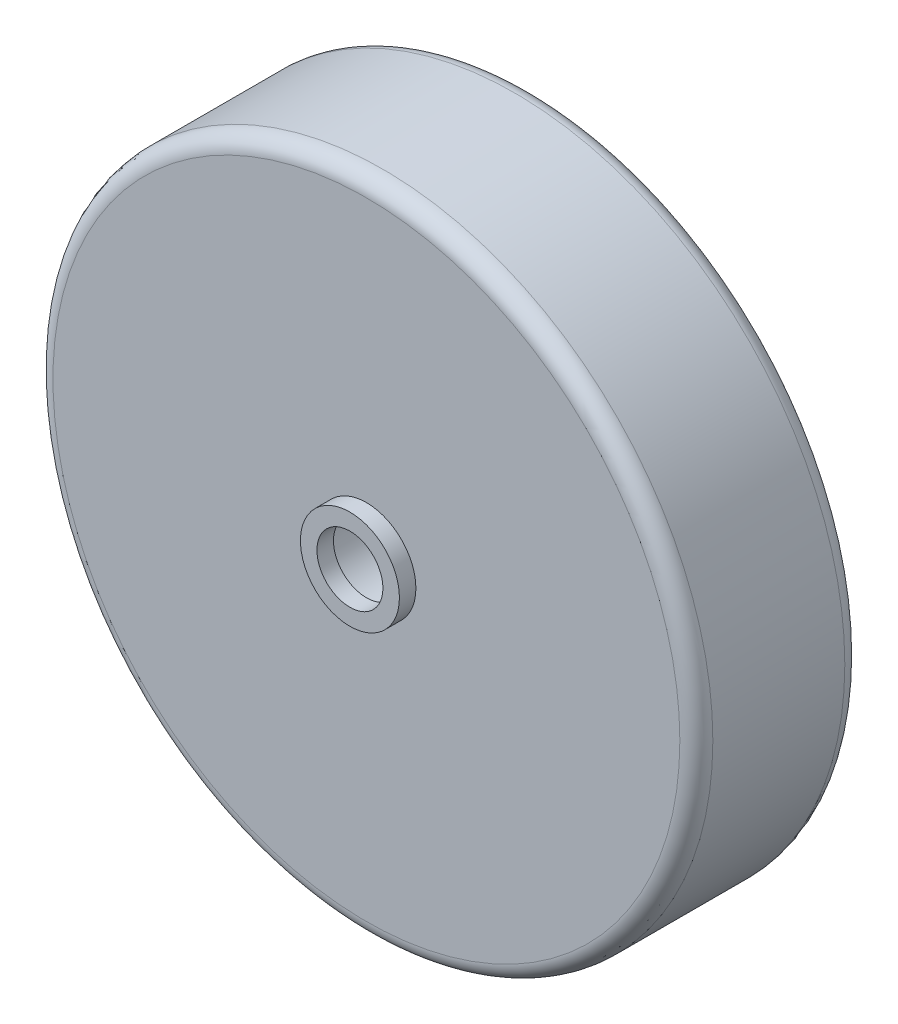
ISO-10303-21;
HEADER;
FILE_DESCRIPTION(('STEP AP214'),'2;1');
FILE_NAME('part.step','',(''),(''),'','','');
FILE_SCHEMA(('AUTOMOTIVE_DESIGN { 1 0 10303 214 1 1 1 1 }'));
ENDSEC;
DATA;
#1=APPLICATION_CONTEXT('core data for automotive mechanical design processes');
#2=APPLICATION_PROTOCOL_DEFINITION('international standard','automotive_design',2000,#1);
#3=PRODUCT_CONTEXT('',#1,'mechanical');
#4=PRODUCT('Part','Part','',(#3));
#5=PRODUCT_RELATED_PRODUCT_CATEGORY('part','',(#4));
#6=PRODUCT_DEFINITION_FORMATION('','',#4);
#7=PRODUCT_DEFINITION_CONTEXT('part definition',#1,'design');
#8=PRODUCT_DEFINITION('design','',#6,#7);
#9=PRODUCT_DEFINITION_SHAPE('','',#8);
#10=(LENGTH_UNIT() NAMED_UNIT(*) SI_UNIT(.MILLI.,.METRE.));
#11=(NAMED_UNIT(*) PLANE_ANGLE_UNIT() SI_UNIT($,.RADIAN.));
#12=(NAMED_UNIT(*) SI_UNIT($,.STERADIAN.) SOLID_ANGLE_UNIT());
#13=UNCERTAINTY_MEASURE_WITH_UNIT(LENGTH_MEASURE(1.E-05),#10,'distance_accuracy_value','');
#14=(GEOMETRIC_REPRESENTATION_CONTEXT(3) GLOBAL_UNCERTAINTY_ASSIGNED_CONTEXT((#13)) GLOBAL_UNIT_ASSIGNED_CONTEXT((#10,
#11,#12)) REPRESENTATION_CONTEXT('',''));
#15=CARTESIAN_POINT('',(0.,0.,0.));
#16=DIRECTION('',(0.,0.,1.));
#17=DIRECTION('',(1.,0.,0.));
#18=AXIS2_PLACEMENT_3D('',#15,#16,#17);
#19=CARTESIAN_POINT('',(0.,0.,55.));
#20=DIRECTION('',(0.,0.,1.));
#21=DIRECTION('',(1.,0.,0.));
#22=AXIS2_PLACEMENT_3D('',#19,#20,#21);
#23=PLANE('',#22);
#24=CARTESIAN_POINT('',(0.,0.,55.));
#25=DIRECTION('',(0.,0.,1.));
#26=DIRECTION('',(1.,0.,0.));
#27=AXIS2_PLACEMENT_3D('',#24,#25,#26);
#28=CIRCLE('',#27,15.);
#29=CARTESIAN_POINT('',(15.,0.,55.));
#30=VERTEX_POINT('',#29);
#31=EDGE_CURVE('E12',#30,#30,#28,.T.);
#32=ORIENTED_EDGE('',*,*,#31,.T.);
#33=EDGE_LOOP('',(#32));
#34=FACE_BOUND('',#33,.T.);
#35=CARTESIAN_POINT('',(0.,0.,55.));
#36=DIRECTION('',(0.,0.,1.));
#37=DIRECTION('',(1.,0.,0.));
#38=AXIS2_PLACEMENT_3D('',#35,#36,#37);
#39=CIRCLE('',#38,10.);
#40=CARTESIAN_POINT('',(10.,0.,55.));
#41=VERTEX_POINT('',#40);
#42=EDGE_CURVE('E65',#41,#41,#39,.T.);
#43=ORIENTED_EDGE('',*,*,#42,.F.);
#44=EDGE_LOOP('',(#43));
#45=FACE_BOUND('',#44,.T.);
#46=ADVANCED_FACE('F54',(#34,#45),#23,.T.);
#47=CARTESIAN_POINT('',(0.,0.,50.));
#48=DIRECTION('',(0.,0.,1.));
#49=DIRECTION('',(1.,0.,0.));
#50=AXIS2_PLACEMENT_3D('',#47,#48,#49);
#51=PLANE('',#50);
#52=CARTESIAN_POINT('',(0.,0.,50.));
#53=DIRECTION('',(0.,0.,1.));
#54=DIRECTION('',(1.,0.,0.));
#55=AXIS2_PLACEMENT_3D('',#52,#53,#54);
#56=CIRCLE('',#55,15.);
#57=CARTESIAN_POINT('',(15.,0.,50.));
#58=VERTEX_POINT('',#57);
#59=EDGE_CURVE('E58',#58,#58,#56,.T.);
#60=ORIENTED_EDGE('',*,*,#59,.F.);
#61=EDGE_LOOP('',(#60));
#62=FACE_BOUND('',#61,.T.);
#63=CARTESIAN_POINT('',(0.,0.,50.));
#64=DIRECTION('',(0.,0.,1.));
#65=DIRECTION('',(1.,0.,0.));
#66=AXIS2_PLACEMENT_3D('',#63,#64,#65);
#67=CIRCLE('',#66,10.);
#68=CARTESIAN_POINT('',(10.,0.,50.));
#69=VERTEX_POINT('',#68);
#70=EDGE_CURVE('E67',#69,#69,#67,.T.);
#71=ORIENTED_EDGE('',*,*,#70,.T.);
#72=EDGE_LOOP('',(#71));
#73=FACE_BOUND('',#72,.T.);
#74=ADVANCED_FACE('F77',(#62,#73),#51,.F.);
#75=CARTESIAN_POINT('',(0.,0.,55.));
#76=DIRECTION('',(0.,0.,-1.));
#77=DIRECTION('',(-1.,0.,0.));
#78=AXIS2_PLACEMENT_3D('',#75,#76,#77);
#79=CYLINDRICAL_SURFACE('',#78,15.);
#80=ORIENTED_EDGE('',*,*,#31,.F.);
#81=EDGE_LOOP('',(#80));
#82=FACE_BOUND('',#81,.T.);
#83=ORIENTED_EDGE('',*,*,#59,.T.);
#84=EDGE_LOOP('',(#83));
#85=FACE_BOUND('',#84,.T.);
#86=ADVANCED_FACE('F56',(#82,#85),#79,.T.);
#87=CARTESIAN_POINT('',(0.,0.,55.));
#88=DIRECTION('',(0.,0.,-1.));
#89=DIRECTION('',(-1.,0.,0.));
#90=AXIS2_PLACEMENT_3D('',#87,#88,#89);
#91=CYLINDRICAL_SURFACE('',#90,10.);
#92=ORIENTED_EDGE('',*,*,#42,.T.);
#93=EDGE_LOOP('',(#92));
#94=FACE_BOUND('',#93,.T.);
#95=ORIENTED_EDGE('',*,*,#70,.F.);
#96=EDGE_LOOP('',(#95));
#97=FACE_BOUND('',#96,.T.);
#98=ADVANCED_FACE('F73',(#94,#97),#91,.F.);
#99=CLOSED_SHELL('',(#46,#74,#86,#98));
#100=MANIFOLD_SOLID_BREP('B2',#99);
#101=CARTESIAN_POINT('',(0.,0.,-5.));
#102=DIRECTION('',(0.,0.,1.));
#103=DIRECTION('',(1.,0.,0.));
#104=AXIS2_PLACEMENT_3D('',#101,#102,#103);
#105=CYLINDRICAL_SURFACE('',#104,10.);
#106=CARTESIAN_POINT('',(0.,0.,-5.));
#107=DIRECTION('',(0.,0.,1.));
#108=DIRECTION('',(1.,0.,0.));
#109=AXIS2_PLACEMENT_3D('',#106,#107,#108);
#110=CIRCLE('',#109,10.);
#111=CARTESIAN_POINT('',(10.,0.,-5.));
#112=VERTEX_POINT('',#111);
#113=EDGE_CURVE('E146',#112,#112,#110,.T.);
#114=ORIENTED_EDGE('',*,*,#113,.F.);
#115=EDGE_LOOP('',(#114));
#116=FACE_BOUND('',#115,.T.);
#117=CARTESIAN_POINT('',(0.,0.,0.));
#118=DIRECTION('',(0.,0.,1.));
#119=DIRECTION('',(1.,0.,0.));
#120=AXIS2_PLACEMENT_3D('',#117,#118,#119);
#121=CIRCLE('',#120,10.);
#122=CARTESIAN_POINT('',(10.,0.,0.));
#123=VERTEX_POINT('',#122);
#124=EDGE_CURVE('E152',#123,#123,#121,.T.);
#125=ORIENTED_EDGE('',*,*,#124,.T.);
#126=EDGE_LOOP('',(#125));
#127=FACE_BOUND('',#126,.T.);
#128=ADVANCED_FACE('F139',(#116,#127),#105,.F.);
#129=CARTESIAN_POINT('',(0.,0.,-5.));
#130=DIRECTION('',(0.,0.,1.));
#131=DIRECTION('',(1.,0.,0.));
#132=AXIS2_PLACEMENT_3D('',#129,#130,#131);
#133=CYLINDRICAL_SURFACE('',#132,15.);
#134=CARTESIAN_POINT('',(0.,0.,-5.));
#135=DIRECTION('',(0.,0.,1.));
#136=DIRECTION('',(1.,0.,0.));
#137=AXIS2_PLACEMENT_3D('',#134,#135,#136);
#138=CIRCLE('',#137,15.);
#139=CARTESIAN_POINT('',(15.,0.,-5.));
#140=VERTEX_POINT('',#139);
#141=EDGE_CURVE('E53',#140,#140,#138,.T.);
#142=ORIENTED_EDGE('',*,*,#141,.T.);
#143=EDGE_LOOP('',(#142));
#144=FACE_BOUND('',#143,.T.);
#145=CARTESIAN_POINT('',(0.,0.,0.));
#146=DIRECTION('',(0.,0.,1.));
#147=DIRECTION('',(1.,0.,0.));
#148=AXIS2_PLACEMENT_3D('',#145,#146,#147);
#149=CIRCLE('',#148,15.);
#150=CARTESIAN_POINT('',(15.,0.,0.));
#151=VERTEX_POINT('',#150);
#152=EDGE_CURVE('E142',#151,#151,#149,.T.);
#153=ORIENTED_EDGE('',*,*,#152,.F.);
#154=EDGE_LOOP('',(#153));
#155=FACE_BOUND('',#154,.T.);
#156=ADVANCED_FACE('F161',(#144,#155),#133,.T.);
#157=CARTESIAN_POINT('',(0.,0.,-5.));
#158=DIRECTION('',(0.,0.,1.));
#159=DIRECTION('',(1.,0.,0.));
#160=AXIS2_PLACEMENT_3D('',#157,#158,#159);
#161=PLANE('',#160);
#162=ORIENTED_EDGE('',*,*,#113,.T.);
#163=EDGE_LOOP('',(#162));
#164=FACE_BOUND('',#163,.T.);
#165=ORIENTED_EDGE('',*,*,#141,.F.);
#166=EDGE_LOOP('',(#165));
#167=FACE_BOUND('',#166,.T.);
#168=ADVANCED_FACE('F163',(#164,#167),#161,.F.);
#169=CARTESIAN_POINT('',(0.,0.,0.));
#170=DIRECTION('',(0.,0.,1.));
#171=DIRECTION('',(1.,0.,0.));
#172=AXIS2_PLACEMENT_3D('',#169,#170,#171);
#173=PLANE('',#172);
#174=ORIENTED_EDGE('',*,*,#124,.F.);
#175=EDGE_LOOP('',(#174));
#176=FACE_BOUND('',#175,.T.);
#177=ORIENTED_EDGE('',*,*,#152,.T.);
#178=EDGE_LOOP('',(#177));
#179=FACE_BOUND('',#178,.T.);
#180=ADVANCED_FACE('F159',(#176,#179),#173,.T.);
#181=CLOSED_SHELL('',(#128,#156,#168,#180));
#182=MANIFOLD_SOLID_BREP('B7',#181);
#183=CARTESIAN_POINT('',(0.,0.,50.));
#184=DIRECTION('',(0.,0.,-1.));
#185=DIRECTION('',(-1.,0.,0.));
#186=AXIS2_PLACEMENT_3D('',#183,#184,#185);
#187=CYLINDRICAL_SURFACE('',#186,15.);
#188=CARTESIAN_POINT('',(0.,0.,50.));
#189=DIRECTION('',(0.,0.,1.));
#190=DIRECTION('',(1.,0.,0.));
#191=AXIS2_PLACEMENT_3D('',#188,#189,#190);
#192=CIRCLE('',#191,15.);
#193=CARTESIAN_POINT('',(15.,0.,50.));
#194=VERTEX_POINT('',#193);
#195=EDGE_CURVE('E237',#194,#194,#192,.T.);
#196=ORIENTED_EDGE('',*,*,#195,.T.);
#197=EDGE_LOOP('',(#196));
#198=FACE_BOUND('',#197,.T.);
#199=CARTESIAN_POINT('',(0.,0.,0.));
#200=DIRECTION('',(0.,0.,1.));
#201=DIRECTION('',(1.,0.,0.));
#202=AXIS2_PLACEMENT_3D('',#199,#200,#201);
#203=CIRCLE('',#202,15.);
#204=CARTESIAN_POINT('',(15.,0.,0.));
#205=VERTEX_POINT('',#204);
#206=EDGE_CURVE('E238',#205,#205,#203,.T.);
#207=ORIENTED_EDGE('',*,*,#206,.F.);
#208=EDGE_LOOP('',(#207));
#209=FACE_BOUND('',#208,.T.);
#210=ADVANCED_FACE('F217',(#198,#209),#187,.F.);
#211=CARTESIAN_POINT('',(0.,0.,50.));
#212=DIRECTION('',(0.,0.,-1.));
#213=DIRECTION('',(-1.,0.,0.));
#214=AXIS2_PLACEMENT_3D('',#211,#212,#213);
#215=CYLINDRICAL_SURFACE('',#214,100.);
#216=CARTESIAN_POINT('',(0.,0.,5.));
#217=DIRECTION('',(0.,0.,1.));
#218=DIRECTION('',(1.,0.,0.));
#219=AXIS2_PLACEMENT_3D('',#216,#217,#218);
#220=CIRCLE('',#219,100.);
#221=CARTESIAN_POINT('',(100.,0.,5.));
#222=VERTEX_POINT('',#221);
#223=EDGE_CURVE('E228',#222,#222,#220,.T.);
#224=ORIENTED_EDGE('',*,*,#223,.T.);
#225=EDGE_LOOP('',(#224));
#226=FACE_BOUND('',#225,.T.);
#227=CARTESIAN_POINT('',(0.,0.,45.));
#228=DIRECTION('',(0.,0.,1.));
#229=DIRECTION('',(1.,0.,0.));
#230=AXIS2_PLACEMENT_3D('',#227,#228,#229);
#231=CIRCLE('',#230,100.);
#232=CARTESIAN_POINT('',(100.,0.,45.));
#233=VERTEX_POINT('',#232);
#234=EDGE_CURVE('E232',#233,#233,#231,.F.);
#235=ORIENTED_EDGE('',*,*,#234,.T.);
#236=EDGE_LOOP('',(#235));
#237=FACE_BOUND('',#236,.T.);
#238=ADVANCED_FACE('F249',(#226,#237),#215,.T.);
#239=CARTESIAN_POINT('',(0.,0.,50.));
#240=DIRECTION('',(0.,0.,1.));
#241=DIRECTION('',(1.,0.,0.));
#242=AXIS2_PLACEMENT_3D('',#239,#240,#241);
#243=PLANE('',#242);
#244=CARTESIAN_POINT('',(0.,0.,50.));
#245=DIRECTION('',(0.,0.,1.));
#246=DIRECTION('',(1.,0.,0.));
#247=AXIS2_PLACEMENT_3D('',#244,#245,#246);
#248=CIRCLE('',#247,95.);
#249=CARTESIAN_POINT('',(95.,0.,50.));
#250=VERTEX_POINT('',#249);
#251=EDGE_CURVE('E138',#250,#250,#248,.T.);
#252=ORIENTED_EDGE('',*,*,#251,.T.);
#253=EDGE_LOOP('',(#252));
#254=FACE_BOUND('',#253,.T.);
#255=ORIENTED_EDGE('',*,*,#195,.F.);
#256=EDGE_LOOP('',(#255));
#257=FACE_BOUND('',#256,.T.);
#258=ADVANCED_FACE('F246',(#254,#257),#243,.T.);
#259=CARTESIAN_POINT('',(0.,0.,0.));
#260=DIRECTION('',(0.,0.,1.));
#261=DIRECTION('',(1.,0.,0.));
#262=AXIS2_PLACEMENT_3D('',#259,#260,#261);
#263=PLANE('',#262);
#264=CARTESIAN_POINT('',(0.,0.,0.));
#265=DIRECTION('',(0.,0.,1.));
#266=DIRECTION('',(1.,0.,0.));
#267=AXIS2_PLACEMENT_3D('',#264,#265,#266);
#268=CIRCLE('',#267,95.);
#269=CARTESIAN_POINT('',(95.,0.,0.));
#270=VERTEX_POINT('',#269);
#271=EDGE_CURVE('E224',#270,#270,#268,.F.);
#272=ORIENTED_EDGE('',*,*,#271,.T.);
#273=EDGE_LOOP('',(#272));
#274=FACE_BOUND('',#273,.T.);
#275=ORIENTED_EDGE('',*,*,#206,.T.);
#276=EDGE_LOOP('',(#275));
#277=FACE_BOUND('',#276,.T.);
#278=ADVANCED_FACE('F248',(#274,#277),#263,.F.);
#279=CARTESIAN_POINT('',(0.,0.,5.));
#280=DIRECTION('',(0.,0.,1.));
#281=DIRECTION('',(1.,0.,0.));
#282=AXIS2_PLACEMENT_3D('',#279,#280,#281);
#283=TOROIDAL_SURFACE('',#282,95.,5.);
#284=ORIENTED_EDGE('',*,*,#271,.F.);
#285=EDGE_LOOP('',(#284));
#286=FACE_BOUND('',#285,.T.);
#287=ORIENTED_EDGE('',*,*,#223,.F.);
#288=EDGE_LOOP('',(#287));
#289=FACE_BOUND('',#288,.T.);
#290=ADVANCED_FACE('F255',(#286,#289),#283,.T.);
#291=CARTESIAN_POINT('',(0.,0.,45.));
#292=DIRECTION('',(0.,0.,1.));
#293=DIRECTION('',(1.,0.,0.));
#294=AXIS2_PLACEMENT_3D('',#291,#292,#293);
#295=TOROIDAL_SURFACE('',#294,95.,5.);
#296=ORIENTED_EDGE('',*,*,#234,.F.);
#297=EDGE_LOOP('',(#296));
#298=FACE_BOUND('',#297,.T.);
#299=ORIENTED_EDGE('',*,*,#251,.F.);
#300=EDGE_LOOP('',(#299));
#301=FACE_BOUND('',#300,.T.);
#302=ADVANCED_FACE('F219',(#298,#301),#295,.T.);
#303=CLOSED_SHELL('',(#210,#238,#258,#278,#290,#302));
#304=MANIFOLD_SOLID_BREP('B48',#303);
#305=ADVANCED_BREP_SHAPE_REPRESENTATION('',(#18,#100,#182,#304),#14);
#306=SHAPE_DEFINITION_REPRESENTATION(#9,#305);
ENDSEC;
END-ISO-10303-21;
